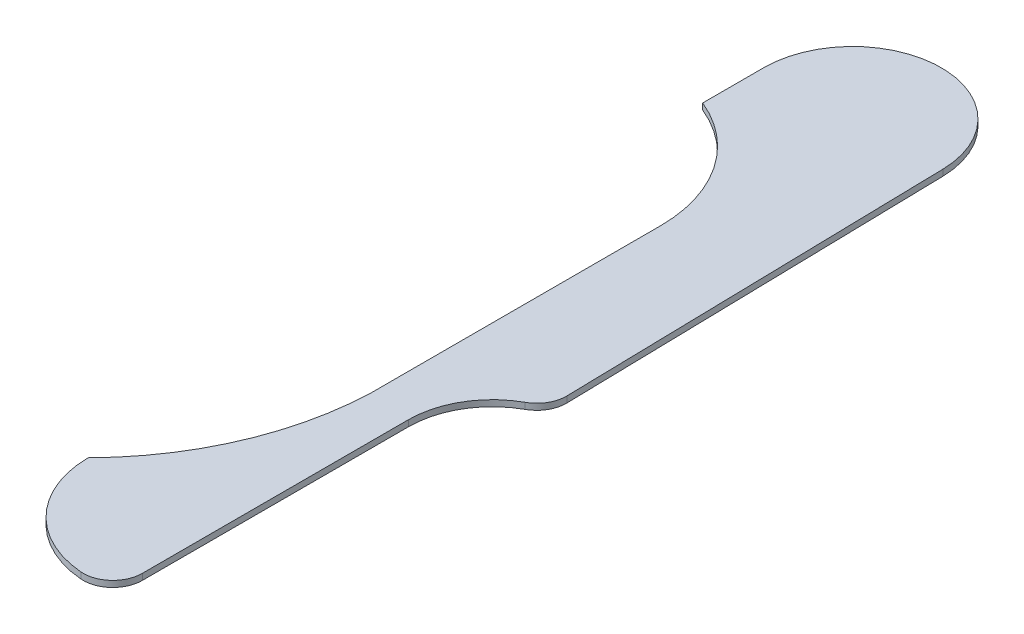
ISO-10303-21;
HEADER;
FILE_DESCRIPTION(('STEP AP214'),'2;1');
FILE_NAME('part.step','',(''),(''),'','','');
FILE_SCHEMA(('AUTOMOTIVE_DESIGN { 1 0 10303 214 1 1 1 1 }'));
ENDSEC;
DATA;
#1=APPLICATION_CONTEXT('core data for automotive mechanical design processes');
#2=APPLICATION_PROTOCOL_DEFINITION('international standard','automotive_design',2000,#1);
#3=PRODUCT_CONTEXT('',#1,'mechanical');
#4=PRODUCT('Part','Part','',(#3));
#5=PRODUCT_RELATED_PRODUCT_CATEGORY('part','',(#4));
#6=PRODUCT_DEFINITION_FORMATION('','',#4);
#7=PRODUCT_DEFINITION_CONTEXT('part definition',#1,'design');
#8=PRODUCT_DEFINITION('design','',#6,#7);
#9=PRODUCT_DEFINITION_SHAPE('','',#8);
#10=(LENGTH_UNIT() NAMED_UNIT(*) SI_UNIT(.MILLI.,.METRE.));
#11=(NAMED_UNIT(*) PLANE_ANGLE_UNIT() SI_UNIT($,.RADIAN.));
#12=(NAMED_UNIT(*) SI_UNIT($,.STERADIAN.) SOLID_ANGLE_UNIT());
#13=UNCERTAINTY_MEASURE_WITH_UNIT(LENGTH_MEASURE(1.E-05),#10,'distance_accuracy_value','');
#14=(GEOMETRIC_REPRESENTATION_CONTEXT(3) GLOBAL_UNCERTAINTY_ASSIGNED_CONTEXT((#13)) GLOBAL_UNIT_ASSIGNED_CONTEXT((#10,
#11,#12)) REPRESENTATION_CONTEXT('',''));
#15=CARTESIAN_POINT('',(0.,0.,0.));
#16=DIRECTION('',(0.,0.,1.));
#17=DIRECTION('',(1.,0.,0.));
#18=AXIS2_PLACEMENT_3D('',#15,#16,#17);
#19=CARTESIAN_POINT('',(0.,0.625,-2.22697318010826));
#20=DIRECTION('',(0.,-1.,0.));
#21=DIRECTION('',(0.,0.,-1.));
#22=AXIS2_PLACEMENT_3D('',#19,#20,#21);
#23=CYLINDRICAL_SURFACE('',#22,9.);
#24=CARTESIAN_POINT('',(0.,0.,-2.22697318010826));
#25=DIRECTION('',(0.,1.,0.));
#26=DIRECTION('',(0.,0.,-1.));
#27=AXIS2_PLACEMENT_3D('',#24,#25,#26);
#28=CIRCLE('',#27,9.);
#29=CARTESIAN_POINT('',(8.99785824371918,0.,-2.42330714541937));
#30=VERTEX_POINT('',#29);
#31=CARTESIAN_POINT('',(-9.,0.,-2.22697318010826));
#32=VERTEX_POINT('',#31);
#33=EDGE_CURVE('E158',#30,#32,#28,.T.);
#34=ORIENTED_EDGE('',*,*,#33,.T.);
#35=DIRECTION('',(0.,-1.,0.));
#36=VECTOR('',#35,1.);
#37=CARTESIAN_POINT('',(-9.,0.625,-2.22697318010826));
#38=LINE('',#37,#36);
#39=CARTESIAN_POINT('',(-9.,0.625,-2.22697318010826));
#40=VERTEX_POINT('',#39);
#41=EDGE_CURVE('E11',#40,#32,#38,.T.);
#42=ORIENTED_EDGE('',*,*,#41,.F.);
#43=CARTESIAN_POINT('',(0.,0.625,-2.22697318010826));
#44=DIRECTION('',(0.,1.,0.));
#45=DIRECTION('',(0.,0.,-1.));
#46=AXIS2_PLACEMENT_3D('',#43,#44,#45);
#47=CIRCLE('',#46,9.);
#48=CARTESIAN_POINT('',(8.99785824371918,0.625,-2.42330714541937));
#49=VERTEX_POINT('',#48);
#50=EDGE_CURVE('E189',#49,#40,#47,.T.);
#51=ORIENTED_EDGE('',*,*,#50,.F.);
#52=DIRECTION('',(0.,-1.,0.));
#53=VECTOR('',#52,1.);
#54=CARTESIAN_POINT('',(8.99785824371918,0.625,-2.42330714541937));
#55=LINE('',#54,#53);
#56=EDGE_CURVE('E154',#49,#30,#55,.T.);
#57=ORIENTED_EDGE('',*,*,#56,.T.);
#58=EDGE_LOOP('',(#34,#42,#51,#57));
#59=FACE_BOUND('',#58,.T.);
#60=ADVANCED_FACE('F39',(#59),#23,.T.);
#61=CARTESIAN_POINT('',(-9.,0.625,-2.22697318010826));
#62=DIRECTION('',(1.,0.,0.));
#63=DIRECTION('',(0.,0.,-1.));
#64=AXIS2_PLACEMENT_3D('',#61,#62,#63);
#65=PLANE('',#64);
#66=DIRECTION('',(0.,0.,1.));
#67=VECTOR('',#66,1.);
#68=CARTESIAN_POINT('',(-9.,0.,-2.22697318010826));
#69=LINE('',#68,#67);
#70=CARTESIAN_POINT('',(-9.,0.,3.97302681989175));
#71=VERTEX_POINT('',#70);
#72=EDGE_CURVE('E162',#32,#71,#69,.T.);
#73=ORIENTED_EDGE('',*,*,#72,.T.);
#74=DIRECTION('',(0.,-1.,0.));
#75=VECTOR('',#74,1.);
#76=CARTESIAN_POINT('',(-9.,0.625,3.97302681989175));
#77=LINE('',#76,#75);
#78=CARTESIAN_POINT('',(-9.,0.625,3.97302681989175));
#79=VERTEX_POINT('',#78);
#80=EDGE_CURVE('E48',#79,#71,#77,.T.);
#81=ORIENTED_EDGE('',*,*,#80,.F.);
#82=DIRECTION('',(0.,0.,1.));
#83=VECTOR('',#82,1.);
#84=CARTESIAN_POINT('',(-9.,0.625,-2.22697318010826));
#85=LINE('',#84,#83);
#86=EDGE_CURVE('E108',#40,#79,#85,.T.);
#87=ORIENTED_EDGE('',*,*,#86,.F.);
#88=ORIENTED_EDGE('',*,*,#41,.T.);
#89=EDGE_LOOP('',(#73,#81,#87,#88));
#90=FACE_BOUND('',#89,.T.);
#91=ADVANCED_FACE('F275',(#90),#65,.F.);
#92=CARTESIAN_POINT('',(-14.35,0.625,16.9104724719515));
#93=DIRECTION('',(0.,-1.,0.));
#94=DIRECTION('',(0.,0.,-1.));
#95=AXIS2_PLACEMENT_3D('',#92,#93,#94);
#96=CYLINDRICAL_SURFACE('',#95,14.);
#97=CARTESIAN_POINT('',(-14.35,0.,16.9104724719515));
#98=DIRECTION('',(0.,-1.,0.));
#99=DIRECTION('',(0.,0.,1.));
#100=AXIS2_PLACEMENT_3D('',#97,#98,#99);
#101=CIRCLE('',#100,14.);
#102=CARTESIAN_POINT('',(-0.349999999999993,0.,16.9104724719515));
#103=VERTEX_POINT('',#102);
#104=EDGE_CURVE('E165',#71,#103,#101,.T.);
#105=ORIENTED_EDGE('',*,*,#104,.T.);
#106=DIRECTION('',(0.,-1.,0.));
#107=VECTOR('',#106,1.);
#108=CARTESIAN_POINT('',(-0.349999999999993,0.625,16.9104724719515));
#109=LINE('',#108,#107);
#110=CARTESIAN_POINT('',(-0.349999999999993,0.625,16.9104724719515));
#111=VERTEX_POINT('',#110);
#112=EDGE_CURVE('E212',#111,#103,#109,.T.);
#113=ORIENTED_EDGE('',*,*,#112,.F.);
#114=CARTESIAN_POINT('',(-14.35,0.625,16.9104724719515));
#115=DIRECTION('',(0.,-1.,0.));
#116=DIRECTION('',(0.,0.,1.));
#117=AXIS2_PLACEMENT_3D('',#114,#115,#116);
#118=CIRCLE('',#117,14.);
#119=EDGE_CURVE('E222',#79,#111,#118,.T.);
#120=ORIENTED_EDGE('',*,*,#119,.F.);
#121=ORIENTED_EDGE('',*,*,#80,.T.);
#122=EDGE_LOOP('',(#105,#113,#120,#121));
#123=FACE_BOUND('',#122,.T.);
#124=ADVANCED_FACE('F220',(#123),#96,.F.);
#125=CARTESIAN_POINT('',(-0.349999999999993,0.625,44.1604724719515));
#126=DIRECTION('',(1.,0.,0.));
#127=DIRECTION('',(0.,0.,-1.));
#128=AXIS2_PLACEMENT_3D('',#125,#126,#127);
#129=PLANE('',#128);
#130=DIRECTION('',(0.,0.,1.));
#131=VECTOR('',#130,1.);
#132=CARTESIAN_POINT('',(-0.349999999999993,0.,44.1604724719515));
#133=LINE('',#132,#131);
#134=CARTESIAN_POINT('',(-0.349999999999993,0.,44.1604724719515));
#135=VERTEX_POINT('',#134);
#136=EDGE_CURVE('E168',#103,#135,#133,.T.);
#137=ORIENTED_EDGE('',*,*,#136,.T.);
#138=DIRECTION('',(0.,-1.,0.));
#139=VECTOR('',#138,1.);
#140=CARTESIAN_POINT('',(-0.349999999999993,0.625,44.1604724719515));
#141=LINE('',#140,#139);
#142=CARTESIAN_POINT('',(-0.349999999999993,0.625,44.1604724719515));
#143=VERTEX_POINT('',#142);
#144=EDGE_CURVE('E208',#143,#135,#141,.T.);
#145=ORIENTED_EDGE('',*,*,#144,.F.);
#146=DIRECTION('',(0.,0.,1.));
#147=VECTOR('',#146,1.);
#148=CARTESIAN_POINT('',(-0.349999999999993,0.625,44.1604724719515));
#149=LINE('',#148,#147);
#150=EDGE_CURVE('E241',#111,#143,#149,.T.);
#151=ORIENTED_EDGE('',*,*,#150,.F.);
#152=ORIENTED_EDGE('',*,*,#112,.T.);
#153=EDGE_LOOP('',(#137,#145,#151,#152));
#154=FACE_BOUND('',#153,.T.);
#155=ADVANCED_FACE('F231',(#154),#129,.F.);
#156=CARTESIAN_POINT('',(-30.3314630649792,0.625,45.2149261140291));
#157=DIRECTION('',(0.,-1.,0.));
#158=DIRECTION('',(0.,0.,-1.));
#159=AXIS2_PLACEMENT_3D('',#156,#157,#158);
#160=CYLINDRICAL_SURFACE('',#159,30.);
#161=CARTESIAN_POINT('',(-30.3314630649792,0.,45.2149261140291));
#162=DIRECTION('',(0.,-1.,0.));
#163=DIRECTION('',(0.,0.,-1.));
#164=AXIS2_PLACEMENT_3D('',#161,#162,#163);
#165=CIRCLE('',#164,30.);
#166=CARTESIAN_POINT('',(-8.99999999999999,0.,66.3092069386373));
#167=VERTEX_POINT('',#166);
#168=EDGE_CURVE('E171',#135,#167,#165,.T.);
#169=ORIENTED_EDGE('',*,*,#168,.T.);
#170=DIRECTION('',(0.,-1.,0.));
#171=VECTOR('',#170,1.);
#172=CARTESIAN_POINT('',(-8.99999999999999,0.625,66.3092069386373));
#173=LINE('',#172,#171);
#174=CARTESIAN_POINT('',(-8.99999999999999,0.625,66.3092069386373));
#175=VERTEX_POINT('',#174);
#176=EDGE_CURVE('E204',#175,#167,#173,.T.);
#177=ORIENTED_EDGE('',*,*,#176,.F.);
#178=CARTESIAN_POINT('',(-30.3314630649792,0.625,45.2149261140291));
#179=DIRECTION('',(0.,-1.,0.));
#180=DIRECTION('',(0.,0.,-1.));
#181=AXIS2_PLACEMENT_3D('',#178,#179,#180);
#182=CIRCLE('',#181,30.);
#183=EDGE_CURVE('E237',#143,#175,#182,.T.);
#184=ORIENTED_EDGE('',*,*,#183,.F.);
#185=ORIENTED_EDGE('',*,*,#144,.T.);
#186=EDGE_LOOP('',(#169,#177,#184,#185));
#187=FACE_BOUND('',#186,.T.);
#188=ADVANCED_FACE('F235',(#187),#160,.F.);
#189=CARTESIAN_POINT('',(1.49975872815147,0.625,66.2380265297654));
#190=DIRECTION('',(0.,-1.,0.));
#191=DIRECTION('',(0.,0.,-1.));
#192=AXIS2_PLACEMENT_3D('',#189,#190,#191);
#193=CYLINDRICAL_SURFACE('',#192,10.5);
#194=CARTESIAN_POINT('',(1.49975872815147,0.,66.2380265297654));
#195=DIRECTION('',(0.,1.,0.));
#196=DIRECTION('',(0.,0.,-1.));
#197=AXIS2_PLACEMENT_3D('',#194,#195,#196);
#198=CIRCLE('',#197,10.5);
#199=CARTESIAN_POINT('',(0.660096508739422,0.,76.7043997008926));
#200=VERTEX_POINT('',#199);
#201=EDGE_CURVE('E174',#167,#200,#198,.T.);
#202=ORIENTED_EDGE('',*,*,#201,.T.);
#203=DIRECTION('',(0.,-1.,0.));
#204=VECTOR('',#203,1.);
#205=CARTESIAN_POINT('',(0.660096508739422,0.625,76.7043997008926));
#206=LINE('',#205,#204);
#207=CARTESIAN_POINT('',(0.660096508739422,0.625,76.7043997008926));
#208=VERTEX_POINT('',#207);
#209=EDGE_CURVE('E200',#208,#200,#206,.T.);
#210=ORIENTED_EDGE('',*,*,#209,.F.);
#211=CARTESIAN_POINT('',(1.49975872815147,0.625,66.2380265297654));
#212=DIRECTION('',(0.,1.,0.));
#213=DIRECTION('',(0.,0.,-1.));
#214=AXIS2_PLACEMENT_3D('',#211,#212,#213);
#215=CIRCLE('',#214,10.5);
#216=EDGE_CURVE('E240',#175,#208,#215,.T.);
#217=ORIENTED_EDGE('',*,*,#216,.F.);
#218=ORIENTED_EDGE('',*,*,#176,.T.);
#219=EDGE_LOOP('',(#202,#210,#217,#218));
#220=FACE_BOUND('',#219,.T.);
#221=ADVANCED_FACE('F288',(#220),#193,.T.);
#222=CARTESIAN_POINT('',(0.900000000000004,0.625,73.7140073662848));
#223=DIRECTION('',(0.,-1.,0.));
#224=DIRECTION('',(0.,0.,-1.));
#225=AXIS2_PLACEMENT_3D('',#222,#223,#224);
#226=CYLINDRICAL_SURFACE('',#225,3.);
#227=CARTESIAN_POINT('',(0.900000000000004,0.,73.7140073662848));
#228=DIRECTION('',(0.,1.,0.));
#229=DIRECTION('',(0.,0.,-1.));
#230=AXIS2_PLACEMENT_3D('',#227,#228,#229);
#231=CIRCLE('',#230,3.);
#232=CARTESIAN_POINT('',(3.9,0.,73.7140073662848));
#233=VERTEX_POINT('',#232);
#234=EDGE_CURVE('E177',#200,#233,#231,.T.);
#235=ORIENTED_EDGE('',*,*,#234,.T.);
#236=DIRECTION('',(0.,-1.,0.));
#237=VECTOR('',#236,1.);
#238=CARTESIAN_POINT('',(3.9,0.625,73.7140073662848));
#239=LINE('',#238,#237);
#240=CARTESIAN_POINT('',(3.9,0.625,73.7140073662848));
#241=VERTEX_POINT('',#240);
#242=EDGE_CURVE('E196',#241,#233,#239,.T.);
#243=ORIENTED_EDGE('',*,*,#242,.F.);
#244=CARTESIAN_POINT('',(0.900000000000004,0.625,73.7140073662848));
#245=DIRECTION('',(0.,1.,0.));
#246=DIRECTION('',(0.,0.,-1.));
#247=AXIS2_PLACEMENT_3D('',#244,#245,#246);
#248=CIRCLE('',#247,3.);
#249=EDGE_CURVE('E245',#208,#241,#248,.T.);
#250=ORIENTED_EDGE('',*,*,#249,.F.);
#251=ORIENTED_EDGE('',*,*,#209,.T.);
#252=EDGE_LOOP('',(#235,#243,#250,#251));
#253=FACE_BOUND('',#252,.T.);
#254=ADVANCED_FACE('F256',(#253),#226,.T.);
#255=CARTESIAN_POINT('',(3.9,0.625,46.7140073662848));
#256=DIRECTION('',(-1.,0.,0.));
#257=DIRECTION('',(0.,0.,1.));
#258=AXIS2_PLACEMENT_3D('',#255,#256,#257);
#259=PLANE('',#258);
#260=DIRECTION('',(0.,0.,-1.));
#261=VECTOR('',#260,1.);
#262=CARTESIAN_POINT('',(3.9,0.,46.7140073662848));
#263=LINE('',#262,#261);
#264=CARTESIAN_POINT('',(3.9,0.,46.7140073662848));
#265=VERTEX_POINT('',#264);
#266=EDGE_CURVE('E180',#233,#265,#263,.T.);
#267=ORIENTED_EDGE('',*,*,#266,.T.);
#268=DIRECTION('',(0.,-1.,0.));
#269=VECTOR('',#268,1.);
#270=CARTESIAN_POINT('',(3.9,0.625,46.7140073662848));
#271=LINE('',#270,#269);
#272=CARTESIAN_POINT('',(3.9,0.625,46.7140073662848));
#273=VERTEX_POINT('',#272);
#274=EDGE_CURVE('E147',#273,#265,#271,.T.);
#275=ORIENTED_EDGE('',*,*,#274,.F.);
#276=DIRECTION('',(0.,0.,-1.));
#277=VECTOR('',#276,1.);
#278=CARTESIAN_POINT('',(3.9,0.625,46.7140073662848));
#279=LINE('',#278,#277);
#280=EDGE_CURVE('E136',#241,#273,#279,.T.);
#281=ORIENTED_EDGE('',*,*,#280,.F.);
#282=ORIENTED_EDGE('',*,*,#242,.T.);
#283=EDGE_LOOP('',(#267,#275,#281,#282));
#284=FACE_BOUND('',#283,.T.);
#285=ADVANCED_FACE('F260',(#284),#259,.F.);
#286=CARTESIAN_POINT('',(12.4,0.625,46.7140073662848));
#287=DIRECTION('',(0.,-1.,0.));
#288=DIRECTION('',(0.,0.,-1.));
#289=AXIS2_PLACEMENT_3D('',#286,#287,#288);
#290=CYLINDRICAL_SURFACE('',#289,8.5);
#291=CARTESIAN_POINT('',(12.4,0.,46.7140073662848));
#292=DIRECTION('',(0.,-1.,0.));
#293=DIRECTION('',(0.,0.,1.));
#294=AXIS2_PLACEMENT_3D('',#291,#292,#293);
#295=CIRCLE('',#294,8.5);
#296=CARTESIAN_POINT('',(8.29749731415829,0.,39.2695818201019));
#297=VERTEX_POINT('',#296);
#298=EDGE_CURVE('E145',#265,#297,#295,.T.);
#299=ORIENTED_EDGE('',*,*,#298,.T.);
#300=DIRECTION('',(0.,-1.,0.));
#301=VECTOR('',#300,1.);
#302=CARTESIAN_POINT('',(8.29749731415829,0.625,39.2695818201019));
#303=LINE('',#302,#301);
#304=CARTESIAN_POINT('',(8.29749731415829,0.625,39.2695818201019));
#305=VERTEX_POINT('',#304);
#306=EDGE_CURVE('E142',#305,#297,#303,.T.);
#307=ORIENTED_EDGE('',*,*,#306,.F.);
#308=CARTESIAN_POINT('',(12.4,0.625,46.7140073662848));
#309=DIRECTION('',(0.,-1.,0.));
#310=DIRECTION('',(0.,0.,1.));
#311=AXIS2_PLACEMENT_3D('',#308,#309,#310);
#312=CIRCLE('',#311,8.5);
#313=EDGE_CURVE('E130',#273,#305,#312,.T.);
#314=ORIENTED_EDGE('',*,*,#313,.F.);
#315=ORIENTED_EDGE('',*,*,#274,.T.);
#316=EDGE_LOOP('',(#299,#307,#314,#315));
#317=FACE_BOUND('',#316,.T.);
#318=ADVANCED_FACE('F143',(#317),#290,.F.);
#319=CARTESIAN_POINT('',(6.84955518974356,0.625,36.6421375096843));
#320=DIRECTION('',(0.,-1.,0.));
#321=DIRECTION('',(0.,0.,-1.));
#322=AXIS2_PLACEMENT_3D('',#319,#320,#321);
#323=CYLINDRICAL_SURFACE('',#322,3.);
#324=CARTESIAN_POINT('',(6.84955518974356,0.,36.6421375096843));
#325=DIRECTION('',(0.,1.,0.));
#326=DIRECTION('',(0.,0.,-1.));
#327=AXIS2_PLACEMENT_3D('',#324,#325,#326);
#328=CIRCLE('',#327,3.);
#329=CARTESIAN_POINT('',(9.84884127098329,0.,36.5766928545806));
#330=VERTEX_POINT('',#329);
#331=EDGE_CURVE('E94',#297,#330,#328,.T.);
#332=ORIENTED_EDGE('',*,*,#331,.T.);
#333=DIRECTION('',(0.,-1.,0.));
#334=VECTOR('',#333,1.);
#335=CARTESIAN_POINT('',(9.84884127098329,0.625,36.5766928545806));
#336=LINE('',#335,#334);
#337=CARTESIAN_POINT('',(9.84884127098329,0.625,36.5766928545806));
#338=VERTEX_POINT('',#337);
#339=EDGE_CURVE('E148',#338,#330,#336,.T.);
#340=ORIENTED_EDGE('',*,*,#339,.F.);
#341=CARTESIAN_POINT('',(6.84955518974356,0.625,36.6421375096843));
#342=DIRECTION('',(0.,1.,0.));
#343=DIRECTION('',(0.,0.,-1.));
#344=AXIS2_PLACEMENT_3D('',#341,#342,#343);
#345=CIRCLE('',#344,3.);
#346=EDGE_CURVE('E134',#305,#338,#345,.T.);
#347=ORIENTED_EDGE('',*,*,#346,.F.);
#348=ORIENTED_EDGE('',*,*,#306,.T.);
#349=EDGE_LOOP('',(#332,#340,#347,#348));
#350=FACE_BOUND('',#349,.T.);
#351=ADVANCED_FACE('F150',(#350),#323,.T.);
#352=CARTESIAN_POINT('',(8.99785824371918,0.625,-2.42330714541937));
#353=DIRECTION('',(-0.999762027079909,0.,0.0218148850345683));
#354=DIRECTION('',(0.0218148850345683,0.,0.999762027079909));
#355=AXIS2_PLACEMENT_3D('',#352,#353,#354);
#356=PLANE('',#355);
#357=DIRECTION('',(-0.0218148850345683,0.,-0.999762027079909));
#358=VECTOR('',#357,1.);
#359=CARTESIAN_POINT('',(8.99785824371918,0.,-2.42330714541937));
#360=LINE('',#359,#358);
#361=EDGE_CURVE('E100',#330,#30,#360,.T.);
#362=ORIENTED_EDGE('',*,*,#361,.T.);
#363=ORIENTED_EDGE('',*,*,#56,.F.);
#364=DIRECTION('',(-0.0218148850345683,0.,-0.999762027079909));
#365=VECTOR('',#364,1.);
#366=CARTESIAN_POINT('',(8.99785824371918,0.625,-2.42330714541937));
#367=LINE('',#366,#365);
#368=EDGE_CURVE('E56',#338,#49,#367,.T.);
#369=ORIENTED_EDGE('',*,*,#368,.F.);
#370=ORIENTED_EDGE('',*,*,#339,.T.);
#371=EDGE_LOOP('',(#362,#363,#369,#370));
#372=FACE_BOUND('',#371,.T.);
#373=ADVANCED_FACE('F264',(#372),#356,.F.);
#374=CARTESIAN_POINT('',(0.,0.625,-2.22697318010826));
#375=DIRECTION('',(0.,-1.,0.));
#376=DIRECTION('',(0.,0.,-1.));
#377=AXIS2_PLACEMENT_3D('',#374,#375,#376);
#378=PLANE('',#377);
#379=ORIENTED_EDGE('',*,*,#50,.T.);
#380=ORIENTED_EDGE('',*,*,#86,.T.);
#381=ORIENTED_EDGE('',*,*,#119,.T.);
#382=ORIENTED_EDGE('',*,*,#150,.T.);
#383=ORIENTED_EDGE('',*,*,#183,.T.);
#384=ORIENTED_EDGE('',*,*,#216,.T.);
#385=ORIENTED_EDGE('',*,*,#249,.T.);
#386=ORIENTED_EDGE('',*,*,#280,.T.);
#387=ORIENTED_EDGE('',*,*,#313,.T.);
#388=ORIENTED_EDGE('',*,*,#346,.T.);
#389=ORIENTED_EDGE('',*,*,#368,.T.);
#390=EDGE_LOOP('',(#379,#380,#381,#382,#383,#384,#385,#386,#387,#388,#389));
#391=FACE_BOUND('',#390,.T.);
#392=ADVANCED_FACE('F132',(#391),#378,.F.);
#393=CARTESIAN_POINT('',(0.,0.,-2.22697318010826));
#394=DIRECTION('',(0.,-1.,0.));
#395=DIRECTION('',(0.,0.,-1.));
#396=AXIS2_PLACEMENT_3D('',#393,#394,#395);
#397=PLANE('',#396);
#398=ORIENTED_EDGE('',*,*,#33,.F.);
#399=ORIENTED_EDGE('',*,*,#361,.F.);
#400=ORIENTED_EDGE('',*,*,#331,.F.);
#401=ORIENTED_EDGE('',*,*,#298,.F.);
#402=ORIENTED_EDGE('',*,*,#266,.F.);
#403=ORIENTED_EDGE('',*,*,#234,.F.);
#404=ORIENTED_EDGE('',*,*,#201,.F.);
#405=ORIENTED_EDGE('',*,*,#168,.F.);
#406=ORIENTED_EDGE('',*,*,#136,.F.);
#407=ORIENTED_EDGE('',*,*,#104,.F.);
#408=ORIENTED_EDGE('',*,*,#72,.F.);
#409=EDGE_LOOP('',(#398,#399,#400,#401,#402,#403,#404,#405,#406,#407,#408));
#410=FACE_BOUND('',#409,.T.);
#411=ADVANCED_FACE('F226',(#410),#397,.T.);
#412=CLOSED_SHELL('',(#60,#91,#124,#155,#188,#221,#254,#285,#318,#351,#373,#392,#411));
#413=MANIFOLD_SOLID_BREP('B2',#412);
#414=ADVANCED_BREP_SHAPE_REPRESENTATION('',(#18,#413),#14);
#415=SHAPE_DEFINITION_REPRESENTATION(#9,#414);
ENDSEC;
END-ISO-10303-21;
